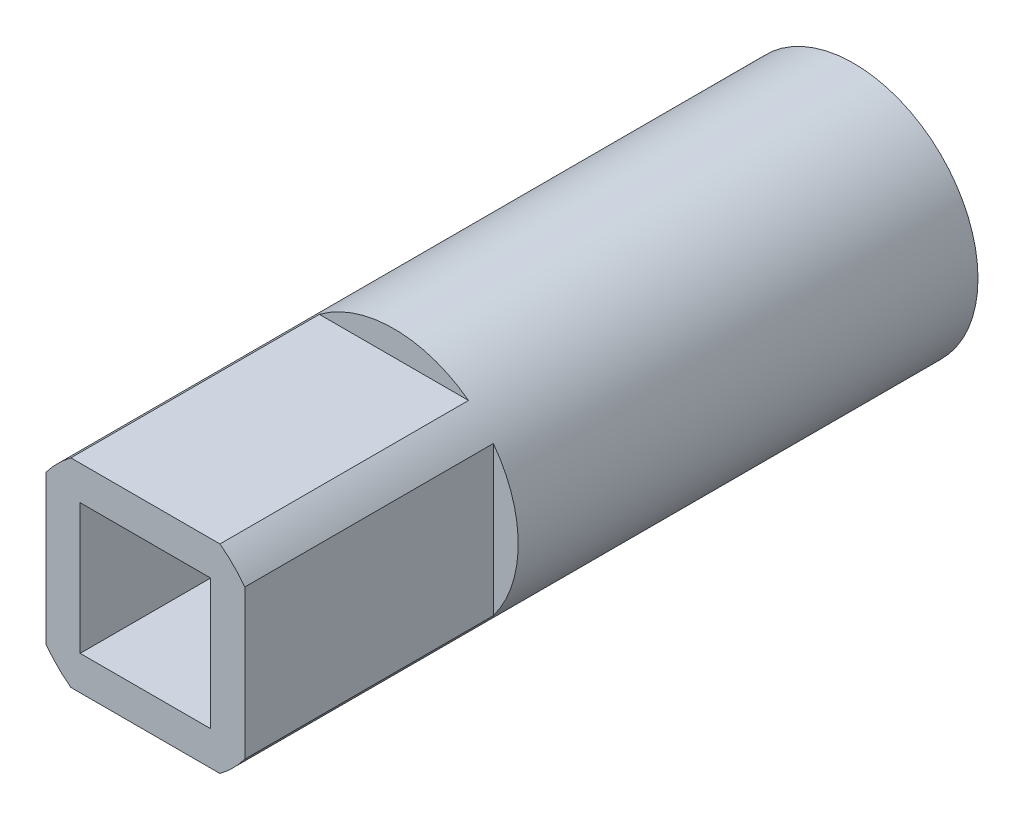
ISO-10303-21;
HEADER;
FILE_DESCRIPTION(('STEP AP214'),'2;1');
FILE_NAME('part.step','',(''),(''),'','','');
FILE_SCHEMA(('AUTOMOTIVE_DESIGN { 1 0 10303 214 1 1 1 1 }'));
ENDSEC;
DATA;
#1=APPLICATION_CONTEXT('core data for automotive mechanical design processes');
#2=APPLICATION_PROTOCOL_DEFINITION('international standard','automotive_design',2000,#1);
#3=PRODUCT_CONTEXT('',#1,'mechanical');
#4=PRODUCT('Part','Part','',(#3));
#5=PRODUCT_RELATED_PRODUCT_CATEGORY('part','',(#4));
#6=PRODUCT_DEFINITION_FORMATION('','',#4);
#7=PRODUCT_DEFINITION_CONTEXT('part definition',#1,'design');
#8=PRODUCT_DEFINITION('design','',#6,#7);
#9=PRODUCT_DEFINITION_SHAPE('','',#8);
#10=(LENGTH_UNIT() NAMED_UNIT(*) SI_UNIT(.MILLI.,.METRE.));
#11=(NAMED_UNIT(*) PLANE_ANGLE_UNIT() SI_UNIT($,.RADIAN.));
#12=(NAMED_UNIT(*) SI_UNIT($,.STERADIAN.) SOLID_ANGLE_UNIT());
#13=UNCERTAINTY_MEASURE_WITH_UNIT(LENGTH_MEASURE(1.E-05),#10,'distance_accuracy_value','');
#14=(GEOMETRIC_REPRESENTATION_CONTEXT(3) GLOBAL_UNCERTAINTY_ASSIGNED_CONTEXT((#13)) GLOBAL_UNIT_ASSIGNED_CONTEXT((#10,
#11,#12)) REPRESENTATION_CONTEXT('',''));
#15=CARTESIAN_POINT('',(0.,0.,0.));
#16=DIRECTION('',(0.,0.,1.));
#17=DIRECTION('',(1.,0.,0.));
#18=AXIS2_PLACEMENT_3D('',#15,#16,#17);
#19=CARTESIAN_POINT('',(0.,0.,18.5));
#20=DIRECTION('',(0.,0.,1.));
#21=DIRECTION('',(1.,0.,0.));
#22=AXIS2_PLACEMENT_3D('',#19,#20,#21);
#23=PLANE('',#22);
#24=CARTESIAN_POINT('',(0.,0.,18.5));
#25=DIRECTION('',(0.,0.,1.));
#26=DIRECTION('',(1.,0.,0.));
#27=AXIS2_PLACEMENT_3D('',#24,#25,#26);
#28=CIRCLE('',#27,5.);
#29=CARTESIAN_POINT('',(-4.,3.,18.5));
#30=VERTEX_POINT('',#29);
#31=CARTESIAN_POINT('',(-4.,-3.,18.5));
#32=VERTEX_POINT('',#31);
#33=EDGE_CURVE('E60',#30,#32,#28,.T.);
#34=ORIENTED_EDGE('',*,*,#33,.T.);
#35=DIRECTION('',(0.,1.,0.));
#36=VECTOR('',#35,1.);
#37=CARTESIAN_POINT('',(-4.,0.,18.5));
#38=LINE('',#37,#36);
#39=EDGE_CURVE('E216',#32,#30,#38,.T.);
#40=ORIENTED_EDGE('',*,*,#39,.T.);
#41=EDGE_LOOP('',(#34,#40));
#42=FACE_BOUND('',#41,.T.);
#43=ADVANCED_FACE('F50',(#42),#23,.T.);
#44=CARTESIAN_POINT('',(3.,4.,18.5));
#45=VERTEX_POINT('',#44);
#46=CARTESIAN_POINT('',(-3.,4.,18.5));
#47=VERTEX_POINT('',#46);
#48=EDGE_CURVE('E11',#45,#47,#28,.T.);
#49=ORIENTED_EDGE('',*,*,#48,.T.);
#50=DIRECTION('',(1.,0.,0.));
#51=VECTOR('',#50,1.);
#52=CARTESIAN_POINT('',(0.,4.,18.5));
#53=LINE('',#52,#51);
#54=EDGE_CURVE('E213',#47,#45,#53,.T.);
#55=ORIENTED_EDGE('',*,*,#54,.T.);
#56=EDGE_LOOP('',(#49,#55));
#57=FACE_BOUND('',#56,.T.);
#58=ADVANCED_FACE('F273',(#57),#23,.T.);
#59=DIRECTION('',(1.,0.,0.));
#60=VECTOR('',#59,1.);
#61=CARTESIAN_POINT('',(0.,-4.,18.5));
#62=LINE('',#61,#60);
#63=CARTESIAN_POINT('',(-3.,-4.,18.5));
#64=VERTEX_POINT('',#63);
#65=CARTESIAN_POINT('',(3.,-4.,18.5));
#66=VERTEX_POINT('',#65);
#67=EDGE_CURVE('E191',#64,#66,#62,.T.);
#68=ORIENTED_EDGE('',*,*,#67,.F.);
#69=EDGE_CURVE('E251',#64,#66,#28,.T.);
#70=ORIENTED_EDGE('',*,*,#69,.T.);
#71=EDGE_LOOP('',(#68,#70));
#72=FACE_BOUND('',#71,.T.);
#73=ADVANCED_FACE('F272',(#72),#23,.T.);
#74=CARTESIAN_POINT('',(0.,0.,18.5));
#75=DIRECTION('',(0.,0.,-1.));
#76=DIRECTION('',(-1.,0.,0.));
#77=AXIS2_PLACEMENT_3D('',#74,#75,#76);
#78=CYLINDRICAL_SURFACE('',#77,5.);
#79=ORIENTED_EDGE('',*,*,#48,.F.);
#80=DIRECTION('',(0.,0.,-1.));
#81=VECTOR('',#80,1.);
#82=CARTESIAN_POINT('',(3.,4.,28.5));
#83=LINE('',#82,#81);
#84=CARTESIAN_POINT('',(3.,4.,28.5));
#85=VERTEX_POINT('',#84);
#86=EDGE_CURVE('E242',#85,#45,#83,.T.);
#87=ORIENTED_EDGE('',*,*,#86,.F.);
#88=CARTESIAN_POINT('',(0.,0.,28.5));
#89=DIRECTION('',(0.,0.,1.));
#90=DIRECTION('',(1.,0.,0.));
#91=AXIS2_PLACEMENT_3D('',#88,#89,#90);
#92=CIRCLE('',#91,5.);
#93=CARTESIAN_POINT('',(4.,3.,28.5));
#94=VERTEX_POINT('',#93);
#95=EDGE_CURVE('E194',#94,#85,#92,.T.);
#96=ORIENTED_EDGE('',*,*,#95,.F.);
#97=DIRECTION('',(0.,0.,-1.));
#98=VECTOR('',#97,1.);
#99=CARTESIAN_POINT('',(4.,3.,28.5));
#100=LINE('',#99,#98);
#101=CARTESIAN_POINT('',(4.,3.,18.5));
#102=VERTEX_POINT('',#101);
#103=EDGE_CURVE('E241',#94,#102,#100,.T.);
#104=ORIENTED_EDGE('',*,*,#103,.T.);
#105=CARTESIAN_POINT('',(4.,-3.,18.5));
#106=VERTEX_POINT('',#105);
#107=EDGE_CURVE('E59',#106,#102,#28,.T.);
#108=ORIENTED_EDGE('',*,*,#107,.F.);
#109=DIRECTION('',(0.,0.,-1.));
#110=VECTOR('',#109,1.);
#111=CARTESIAN_POINT('',(4.,-3.,28.5));
#112=LINE('',#111,#110);
#113=CARTESIAN_POINT('',(4.,-3.,28.5));
#114=VERTEX_POINT('',#113);
#115=EDGE_CURVE('E247',#114,#106,#112,.T.);
#116=ORIENTED_EDGE('',*,*,#115,.F.);
#117=CARTESIAN_POINT('',(3.,-4.,28.5));
#118=VERTEX_POINT('',#117);
#119=EDGE_CURVE('E188',#118,#114,#92,.T.);
#120=ORIENTED_EDGE('',*,*,#119,.F.);
#121=DIRECTION('',(0.,0.,-1.));
#122=VECTOR('',#121,1.);
#123=CARTESIAN_POINT('',(3.,-4.,28.5));
#124=LINE('',#123,#122);
#125=EDGE_CURVE('E209',#118,#66,#124,.T.);
#126=ORIENTED_EDGE('',*,*,#125,.T.);
#127=ORIENTED_EDGE('',*,*,#69,.F.);
#128=DIRECTION('',(0.,0.,-1.));
#129=VECTOR('',#128,1.);
#130=CARTESIAN_POINT('',(-3.,-4.,28.5));
#131=LINE('',#130,#129);
#132=CARTESIAN_POINT('',(-3.,-4.,28.5));
#133=VERTEX_POINT('',#132);
#134=EDGE_CURVE('E223',#133,#64,#131,.T.);
#135=ORIENTED_EDGE('',*,*,#134,.F.);
#136=CARTESIAN_POINT('',(-4.,-3.,28.5));
#137=VERTEX_POINT('',#136);
#138=EDGE_CURVE('E192',#137,#133,#92,.T.);
#139=ORIENTED_EDGE('',*,*,#138,.F.);
#140=DIRECTION('',(0.,0.,-1.));
#141=VECTOR('',#140,1.);
#142=CARTESIAN_POINT('',(-4.,-3.,28.5));
#143=LINE('',#142,#141);
#144=EDGE_CURVE('E229',#137,#32,#143,.T.);
#145=ORIENTED_EDGE('',*,*,#144,.T.);
#146=ORIENTED_EDGE('',*,*,#33,.F.);
#147=DIRECTION('',(0.,0.,-1.));
#148=VECTOR('',#147,1.);
#149=CARTESIAN_POINT('',(-4.,3.,28.5));
#150=LINE('',#149,#148);
#151=CARTESIAN_POINT('',(-4.,3.,28.5));
#152=VERTEX_POINT('',#151);
#153=EDGE_CURVE('E231',#152,#30,#150,.T.);
#154=ORIENTED_EDGE('',*,*,#153,.F.);
#155=CARTESIAN_POINT('',(-3.,4.,28.5));
#156=VERTEX_POINT('',#155);
#157=EDGE_CURVE('E205',#156,#152,#92,.T.);
#158=ORIENTED_EDGE('',*,*,#157,.F.);
#159=DIRECTION('',(0.,0.,-1.));
#160=VECTOR('',#159,1.);
#161=CARTESIAN_POINT('',(-3.,4.,28.5));
#162=LINE('',#161,#160);
#163=EDGE_CURVE('E240',#156,#47,#162,.T.);
#164=ORIENTED_EDGE('',*,*,#163,.T.);
#165=EDGE_LOOP('',(#79,#87,#96,#104,#108,#116,#120,#126,#127,#135,#139,#145,#146,#154,#158,#164));
#166=FACE_BOUND('',#165,.T.);
#167=CARTESIAN_POINT('',(0.,0.,0.));
#168=DIRECTION('',(0.,0.,1.));
#169=DIRECTION('',(1.,0.,0.));
#170=AXIS2_PLACEMENT_3D('',#167,#168,#169);
#171=CIRCLE('',#170,5.);
#172=CARTESIAN_POINT('',(5.,0.,0.));
#173=VERTEX_POINT('',#172);
#174=EDGE_CURVE('E51',#173,#173,#171,.T.);
#175=ORIENTED_EDGE('',*,*,#174,.T.);
#176=EDGE_LOOP('',(#175));
#177=FACE_BOUND('',#176,.T.);
#178=ADVANCED_FACE('F47',(#166,#177),#78,.T.);
#179=DIRECTION('',(0.,1.,0.));
#180=VECTOR('',#179,1.);
#181=CARTESIAN_POINT('',(4.,0.,18.5));
#182=LINE('',#181,#180);
#183=EDGE_CURVE('E75',#106,#102,#182,.T.);
#184=ORIENTED_EDGE('',*,*,#183,.F.);
#185=ORIENTED_EDGE('',*,*,#107,.T.);
#186=EDGE_LOOP('',(#184,#185));
#187=FACE_BOUND('',#186,.T.);
#188=ADVANCED_FACE('F263',(#187),#23,.T.);
#189=CARTESIAN_POINT('',(0.,0.,0.));
#190=DIRECTION('',(0.,0.,1.));
#191=DIRECTION('',(1.,0.,0.));
#192=AXIS2_PLACEMENT_3D('',#189,#190,#191);
#193=PLANE('',#192);
#194=ORIENTED_EDGE('',*,*,#174,.F.);
#195=EDGE_LOOP('',(#194));
#196=FACE_BOUND('',#195,.T.);
#197=ADVANCED_FACE('F257',(#196),#193,.F.);
#198=CARTESIAN_POINT('',(4.,0.,28.5));
#199=DIRECTION('',(-1.,0.,0.));
#200=DIRECTION('',(0.,0.,1.));
#201=AXIS2_PLACEMENT_3D('',#198,#199,#200);
#202=PLANE('',#201);
#203=ORIENTED_EDGE('',*,*,#183,.T.);
#204=ORIENTED_EDGE('',*,*,#103,.F.);
#205=DIRECTION('',(0.,1.,0.));
#206=VECTOR('',#205,1.);
#207=CARTESIAN_POINT('',(4.,0.,28.5));
#208=LINE('',#207,#206);
#209=EDGE_CURVE('E195',#114,#94,#208,.T.);
#210=ORIENTED_EDGE('',*,*,#209,.F.);
#211=ORIENTED_EDGE('',*,*,#115,.T.);
#212=EDGE_LOOP('',(#203,#204,#210,#211));
#213=FACE_BOUND('',#212,.T.);
#214=ADVANCED_FACE('F265',(#213),#202,.F.);
#215=CARTESIAN_POINT('',(0.,4.,28.5));
#216=DIRECTION('',(0.,1.,0.));
#217=DIRECTION('',(0.,0.,1.));
#218=AXIS2_PLACEMENT_3D('',#215,#216,#217);
#219=PLANE('',#218);
#220=ORIENTED_EDGE('',*,*,#54,.F.);
#221=ORIENTED_EDGE('',*,*,#163,.F.);
#222=DIRECTION('',(1.,0.,0.));
#223=VECTOR('',#222,1.);
#224=CARTESIAN_POINT('',(0.,4.,28.5));
#225=LINE('',#224,#223);
#226=EDGE_CURVE('E196',#156,#85,#225,.T.);
#227=ORIENTED_EDGE('',*,*,#226,.T.);
#228=ORIENTED_EDGE('',*,*,#86,.T.);
#229=EDGE_LOOP('',(#220,#221,#227,#228));
#230=FACE_BOUND('',#229,.T.);
#231=ADVANCED_FACE('F268',(#230),#219,.T.);
#232=CARTESIAN_POINT('',(-4.,0.,28.5));
#233=DIRECTION('',(-1.,0.,0.));
#234=DIRECTION('',(0.,0.,1.));
#235=AXIS2_PLACEMENT_3D('',#232,#233,#234);
#236=PLANE('',#235);
#237=ORIENTED_EDGE('',*,*,#39,.F.);
#238=ORIENTED_EDGE('',*,*,#144,.F.);
#239=DIRECTION('',(0.,1.,0.));
#240=VECTOR('',#239,1.);
#241=CARTESIAN_POINT('',(-4.,0.,28.5));
#242=LINE('',#241,#240);
#243=EDGE_CURVE('E201',#137,#152,#242,.T.);
#244=ORIENTED_EDGE('',*,*,#243,.T.);
#245=ORIENTED_EDGE('',*,*,#153,.T.);
#246=EDGE_LOOP('',(#237,#238,#244,#245));
#247=FACE_BOUND('',#246,.T.);
#248=ADVANCED_FACE('F283',(#247),#236,.T.);
#249=CARTESIAN_POINT('',(0.,-4.,28.5));
#250=DIRECTION('',(0.,1.,0.));
#251=DIRECTION('',(0.,0.,1.));
#252=AXIS2_PLACEMENT_3D('',#249,#250,#251);
#253=PLANE('',#252);
#254=ORIENTED_EDGE('',*,*,#67,.T.);
#255=ORIENTED_EDGE('',*,*,#125,.F.);
#256=DIRECTION('',(1.,0.,0.));
#257=VECTOR('',#256,1.);
#258=CARTESIAN_POINT('',(0.,-4.,28.5));
#259=LINE('',#258,#257);
#260=EDGE_CURVE('E210',#133,#118,#259,.T.);
#261=ORIENTED_EDGE('',*,*,#260,.F.);
#262=ORIENTED_EDGE('',*,*,#134,.T.);
#263=EDGE_LOOP('',(#254,#255,#261,#262));
#264=FACE_BOUND('',#263,.T.);
#265=ADVANCED_FACE('F290',(#264),#253,.F.);
#266=CARTESIAN_POINT('',(0.,0.,28.5));
#267=DIRECTION('',(0.,0.,1.));
#268=DIRECTION('',(1.,0.,0.));
#269=AXIS2_PLACEMENT_3D('',#266,#267,#268);
#270=PLANE('',#269);
#271=DIRECTION('',(0.,1.,0.));
#272=VECTOR('',#271,1.);
#273=CARTESIAN_POINT('',(2.625,-2.625,28.5));
#274=LINE('',#273,#272);
#275=CARTESIAN_POINT('',(2.625,-2.625,28.5));
#276=VERTEX_POINT('',#275);
#277=CARTESIAN_POINT('',(2.625,2.625,28.5));
#278=VERTEX_POINT('',#277);
#279=EDGE_CURVE('E61',#276,#278,#274,.T.);
#280=ORIENTED_EDGE('',*,*,#279,.F.);
#281=DIRECTION('',(1.,0.,0.));
#282=VECTOR('',#281,1.);
#283=CARTESIAN_POINT('',(-2.625,-2.625,28.5));
#284=LINE('',#283,#282);
#285=CARTESIAN_POINT('',(-2.625,-2.625,28.5));
#286=VERTEX_POINT('',#285);
#287=EDGE_CURVE('E161',#286,#276,#284,.T.);
#288=ORIENTED_EDGE('',*,*,#287,.F.);
#289=DIRECTION('',(0.,-1.,0.));
#290=VECTOR('',#289,1.);
#291=CARTESIAN_POINT('',(-2.625,-2.625,28.5));
#292=LINE('',#291,#290);
#293=CARTESIAN_POINT('',(-2.625,2.625,28.5));
#294=VERTEX_POINT('',#293);
#295=EDGE_CURVE('E164',#294,#286,#292,.T.);
#296=ORIENTED_EDGE('',*,*,#295,.F.);
#297=DIRECTION('',(-1.,0.,0.));
#298=VECTOR('',#297,1.);
#299=CARTESIAN_POINT('',(-2.625,2.625,28.5));
#300=LINE('',#299,#298);
#301=EDGE_CURVE('E174',#278,#294,#300,.T.);
#302=ORIENTED_EDGE('',*,*,#301,.F.);
#303=EDGE_LOOP('',(#280,#288,#296,#302));
#304=FACE_BOUND('',#303,.T.);
#305=ORIENTED_EDGE('',*,*,#119,.T.);
#306=ORIENTED_EDGE('',*,*,#209,.T.);
#307=ORIENTED_EDGE('',*,*,#95,.T.);
#308=ORIENTED_EDGE('',*,*,#226,.F.);
#309=ORIENTED_EDGE('',*,*,#157,.T.);
#310=ORIENTED_EDGE('',*,*,#243,.F.);
#311=ORIENTED_EDGE('',*,*,#138,.T.);
#312=ORIENTED_EDGE('',*,*,#260,.T.);
#313=EDGE_LOOP('',(#305,#306,#307,#308,#309,#310,#311,#312));
#314=FACE_BOUND('',#313,.T.);
#315=ADVANCED_FACE('F292',(#304,#314),#270,.T.);
#316=CARTESIAN_POINT('',(2.625,-2.625,18.5));
#317=DIRECTION('',(1.,0.,0.));
#318=DIRECTION('',(0.,0.,-1.));
#319=AXIS2_PLACEMENT_3D('',#316,#317,#318);
#320=PLANE('',#319);
#321=ORIENTED_EDGE('',*,*,#279,.T.);
#322=DIRECTION('',(0.,0.,1.));
#323=VECTOR('',#322,1.);
#324=CARTESIAN_POINT('',(2.625,2.625,18.5));
#325=LINE('',#324,#323);
#326=CARTESIAN_POINT('',(2.625,2.625,18.5));
#327=VERTEX_POINT('',#326);
#328=EDGE_CURVE('E138',#327,#278,#325,.T.);
#329=ORIENTED_EDGE('',*,*,#328,.F.);
#330=DIRECTION('',(0.,1.,0.));
#331=VECTOR('',#330,1.);
#332=CARTESIAN_POINT('',(2.625,-2.625,18.5));
#333=LINE('',#332,#331);
#334=CARTESIAN_POINT('',(2.625,-2.625,18.5));
#335=VERTEX_POINT('',#334);
#336=EDGE_CURVE('E139',#335,#327,#333,.T.);
#337=ORIENTED_EDGE('',*,*,#336,.F.);
#338=DIRECTION('',(0.,0.,1.));
#339=VECTOR('',#338,1.);
#340=CARTESIAN_POINT('',(2.625,-2.625,18.5));
#341=LINE('',#340,#339);
#342=EDGE_CURVE('E179',#335,#276,#341,.T.);
#343=ORIENTED_EDGE('',*,*,#342,.T.);
#344=EDGE_LOOP('',(#321,#329,#337,#343));
#345=FACE_BOUND('',#344,.T.);
#346=ADVANCED_FACE('F136',(#345),#320,.F.);
#347=CARTESIAN_POINT('',(-2.625,-2.625,18.5));
#348=DIRECTION('',(0.,-1.,0.));
#349=DIRECTION('',(0.,0.,-1.));
#350=AXIS2_PLACEMENT_3D('',#347,#348,#349);
#351=PLANE('',#350);
#352=ORIENTED_EDGE('',*,*,#287,.T.);
#353=ORIENTED_EDGE('',*,*,#342,.F.);
#354=DIRECTION('',(1.,0.,0.));
#355=VECTOR('',#354,1.);
#356=CARTESIAN_POINT('',(-2.625,-2.625,18.5));
#357=LINE('',#356,#355);
#358=CARTESIAN_POINT('',(-2.625,-2.625,18.5));
#359=VERTEX_POINT('',#358);
#360=EDGE_CURVE('E150',#359,#335,#357,.T.);
#361=ORIENTED_EDGE('',*,*,#360,.F.);
#362=DIRECTION('',(0.,0.,1.));
#363=VECTOR('',#362,1.);
#364=CARTESIAN_POINT('',(-2.625,-2.625,18.5));
#365=LINE('',#364,#363);
#366=EDGE_CURVE('E181',#359,#286,#365,.T.);
#367=ORIENTED_EDGE('',*,*,#366,.T.);
#368=EDGE_LOOP('',(#352,#353,#361,#367));
#369=FACE_BOUND('',#368,.T.);
#370=ADVANCED_FACE('F298',(#369),#351,.F.);
#371=CARTESIAN_POINT('',(-2.625,-2.625,18.5));
#372=DIRECTION('',(-1.,0.,0.));
#373=DIRECTION('',(0.,0.,1.));
#374=AXIS2_PLACEMENT_3D('',#371,#372,#373);
#375=PLANE('',#374);
#376=ORIENTED_EDGE('',*,*,#295,.T.);
#377=ORIENTED_EDGE('',*,*,#366,.F.);
#378=DIRECTION('',(0.,-1.,0.));
#379=VECTOR('',#378,1.);
#380=CARTESIAN_POINT('',(-2.625,-2.625,18.5));
#381=LINE('',#380,#379);
#382=CARTESIAN_POINT('',(-2.625,2.625,18.5));
#383=VERTEX_POINT('',#382);
#384=EDGE_CURVE('E156',#383,#359,#381,.T.);
#385=ORIENTED_EDGE('',*,*,#384,.F.);
#386=DIRECTION('',(0.,0.,1.));
#387=VECTOR('',#386,1.);
#388=CARTESIAN_POINT('',(-2.625,2.625,18.5));
#389=LINE('',#388,#387);
#390=EDGE_CURVE('E148',#383,#294,#389,.T.);
#391=ORIENTED_EDGE('',*,*,#390,.T.);
#392=EDGE_LOOP('',(#376,#377,#385,#391));
#393=FACE_BOUND('',#392,.T.);
#394=ADVANCED_FACE('F303',(#393),#375,.F.);
#395=CARTESIAN_POINT('',(-2.625,2.625,18.5));
#396=DIRECTION('',(0.,1.,0.));
#397=DIRECTION('',(0.,0.,1.));
#398=AXIS2_PLACEMENT_3D('',#395,#396,#397);
#399=PLANE('',#398);
#400=ORIENTED_EDGE('',*,*,#301,.T.);
#401=ORIENTED_EDGE('',*,*,#390,.F.);
#402=DIRECTION('',(-1.,0.,0.));
#403=VECTOR('',#402,1.);
#404=CARTESIAN_POINT('',(-2.625,2.625,18.5));
#405=LINE('',#404,#403);
#406=EDGE_CURVE('E147',#327,#383,#405,.T.);
#407=ORIENTED_EDGE('',*,*,#406,.F.);
#408=ORIENTED_EDGE('',*,*,#328,.T.);
#409=EDGE_LOOP('',(#400,#401,#407,#408));
#410=FACE_BOUND('',#409,.T.);
#411=ADVANCED_FACE('F151',(#410),#399,.F.);
#412=CARTESIAN_POINT('',(0.,0.,18.5));
#413=DIRECTION('',(0.,0.,-1.));
#414=DIRECTION('',(-1.,0.,0.));
#415=AXIS2_PLACEMENT_3D('',#412,#413,#414);
#416=PLANE('',#415);
#417=ORIENTED_EDGE('',*,*,#336,.T.);
#418=ORIENTED_EDGE('',*,*,#406,.T.);
#419=ORIENTED_EDGE('',*,*,#384,.T.);
#420=ORIENTED_EDGE('',*,*,#360,.T.);
#421=EDGE_LOOP('',(#417,#418,#419,#420));
#422=FACE_BOUND('',#421,.T.);
#423=ADVANCED_FACE('F158',(#422),#416,.F.);
#424=CLOSED_SHELL('',(#43,#58,#73,#178,#188,#197,#214,#231,#248,#265,#315,#346,#370,#394,#411,#423));
#425=MANIFOLD_SOLID_BREP('B2',#424);
#426=ADVANCED_BREP_SHAPE_REPRESENTATION('',(#18,#425),#14);
#427=SHAPE_DEFINITION_REPRESENTATION(#9,#426);
ENDSEC;
END-ISO-10303-21;
